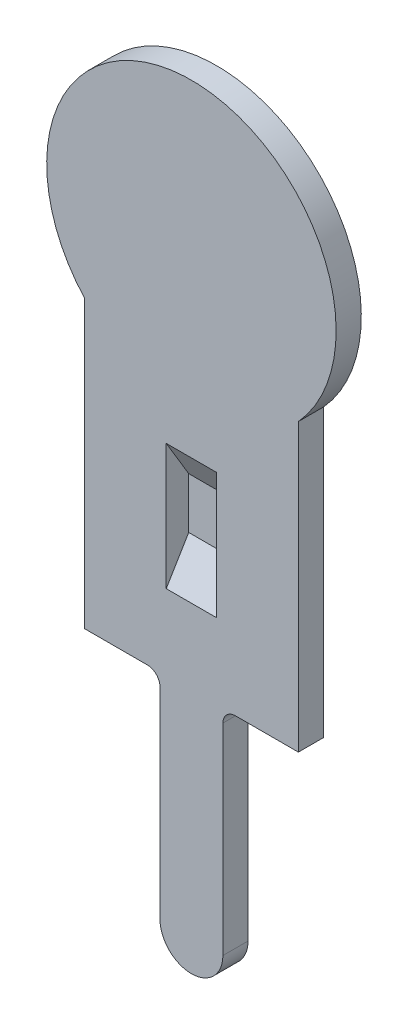
ISO-10303-21;
HEADER;
FILE_DESCRIPTION(('STEP AP214'),'2;1');
FILE_NAME('part.step','',(''),(''),'','','');
FILE_SCHEMA(('AUTOMOTIVE_DESIGN { 1 0 10303 214 1 1 1 1 }'));
ENDSEC;
DATA;
#1=APPLICATION_CONTEXT('core data for automotive mechanical design processes');
#2=APPLICATION_PROTOCOL_DEFINITION('international standard','automotive_design',2000,#1);
#3=PRODUCT_CONTEXT('',#1,'mechanical');
#4=PRODUCT('Part','Part','',(#3));
#5=PRODUCT_RELATED_PRODUCT_CATEGORY('part','',(#4));
#6=PRODUCT_DEFINITION_FORMATION('','',#4);
#7=PRODUCT_DEFINITION_CONTEXT('part definition',#1,'design');
#8=PRODUCT_DEFINITION('design','',#6,#7);
#9=PRODUCT_DEFINITION_SHAPE('','',#8);
#10=(LENGTH_UNIT() NAMED_UNIT(*) SI_UNIT(.MILLI.,.METRE.));
#11=(NAMED_UNIT(*) PLANE_ANGLE_UNIT() SI_UNIT($,.RADIAN.));
#12=(NAMED_UNIT(*) SI_UNIT($,.STERADIAN.) SOLID_ANGLE_UNIT());
#13=UNCERTAINTY_MEASURE_WITH_UNIT(LENGTH_MEASURE(1.E-05),#10,'distance_accuracy_value','');
#14=(GEOMETRIC_REPRESENTATION_CONTEXT(3) GLOBAL_UNCERTAINTY_ASSIGNED_CONTEXT((#13)) GLOBAL_UNIT_ASSIGNED_CONTEXT((#10,
#11,#12)) REPRESENTATION_CONTEXT('',''));
#15=CARTESIAN_POINT('',(0.,0.,0.));
#16=DIRECTION('',(0.,0.,1.));
#17=DIRECTION('',(1.,0.,0.));
#18=AXIS2_PLACEMENT_3D('',#15,#16,#17);
#19=CARTESIAN_POINT('',(0.,6.5,-14.7));
#20=DIRECTION('',(0.,0.,-1.));
#21=DIRECTION('',(-1.,0.,0.));
#22=AXIS2_PLACEMENT_3D('',#19,#20,#21);
#23=PLANE('',#22);
#24=CARTESIAN_POINT('',(0.,6.5,-14.7));
#25=DIRECTION('',(0.,0.,-1.));
#26=DIRECTION('',(-1.,0.,0.));
#27=AXIS2_PLACEMENT_3D('',#24,#25,#26);
#28=CIRCLE('',#27,0.6);
#29=CARTESIAN_POINT('',(-0.6,6.5,-14.7));
#30=VERTEX_POINT('',#29);
#31=EDGE_CURVE('E307',#30,#30,#28,.T.);
#32=ORIENTED_EDGE('',*,*,#31,.T.);
#33=EDGE_LOOP('',(#32));
#34=FACE_BOUND('',#33,.T.);
#35=ADVANCED_FACE('F17',(#34),#23,.T.);
#36=CARTESIAN_POINT('',(0.,6.5,-15.1));
#37=DIRECTION('',(0.,0.,-1.));
#38=DIRECTION('',(-1.,0.,0.));
#39=AXIS2_PLACEMENT_3D('',#36,#37,#38);
#40=CYLINDRICAL_SURFACE('',#39,0.6);
#41=CARTESIAN_POINT('',(0.,6.5,-14.85));
#42=DIRECTION('',(0.,0.,-1.));
#43=DIRECTION('',(-1.,0.,0.));
#44=AXIS2_PLACEMENT_3D('',#41,#42,#43);
#45=CIRCLE('',#44,0.6);
#46=CARTESIAN_POINT('',(-0.6,6.5,-14.85));
#47=VERTEX_POINT('',#46);
#48=EDGE_CURVE('E305',#47,#47,#45,.F.);
#49=ORIENTED_EDGE('',*,*,#48,.F.);
#50=EDGE_LOOP('',(#49));
#51=FACE_BOUND('',#50,.T.);
#52=ORIENTED_EDGE('',*,*,#31,.F.);
#53=EDGE_LOOP('',(#52));
#54=FACE_BOUND('',#53,.T.);
#55=ADVANCED_FACE('F368',(#51,#54),#40,.F.);
#56=CARTESIAN_POINT('',(0.,6.5,-14.85));
#57=DIRECTION('',(0.,0.,-1.));
#58=DIRECTION('',(-1.,0.,0.));
#59=AXIS2_PLACEMENT_3D('',#56,#57,#58);
#60=TOROIDAL_SURFACE('',#59,0.85,0.25);
#61=ORIENTED_EDGE('',*,*,#48,.T.);
#62=EDGE_LOOP('',(#61));
#63=FACE_BOUND('',#62,.T.);
#64=CARTESIAN_POINT('',(0.,6.5,-15.1));
#65=DIRECTION('',(0.,0.,-1.));
#66=DIRECTION('',(-1.,0.,0.));
#67=AXIS2_PLACEMENT_3D('',#64,#65,#66);
#68=CIRCLE('',#67,0.85);
#69=CARTESIAN_POINT('',(0.85,6.5,-15.1));
#70=VERTEX_POINT('',#69);
#71=CARTESIAN_POINT('',(-0.85,6.5,-15.1));
#72=VERTEX_POINT('',#71);
#73=EDGE_CURVE('E261',#70,#72,#68,.F.);
#74=ORIENTED_EDGE('',*,*,#73,.F.);
#75=CARTESIAN_POINT('',(0.,6.5,-15.1));
#76=DIRECTION('',(0.,0.,-1.));
#77=DIRECTION('',(1.,0.,0.));
#78=AXIS2_PLACEMENT_3D('',#75,#76,#77);
#79=CIRCLE('',#78,0.85);
#80=EDGE_CURVE('E304',#72,#70,#79,.F.);
#81=ORIENTED_EDGE('',*,*,#80,.F.);
#82=EDGE_LOOP('',(#74,#81));
#83=FACE_BOUND('',#82,.T.);
#84=ADVANCED_FACE('F239',(#63,#83),#60,.T.);
#85=CARTESIAN_POINT('',(0.,6.5,-15.1));
#86=DIRECTION('',(0.,0.,-1.));
#87=DIRECTION('',(-1.,0.,0.));
#88=AXIS2_PLACEMENT_3D('',#85,#86,#87);
#89=PLANE('',#88);
#90=ORIENTED_EDGE('',*,*,#80,.T.);
#91=ORIENTED_EDGE('',*,*,#73,.T.);
#92=EDGE_LOOP('',(#90,#91));
#93=FACE_BOUND('',#92,.T.);
#94=CARTESIAN_POINT('',(0.,6.5,-15.1));
#95=DIRECTION('',(0.,0.,1.));
#96=DIRECTION('',(1.,0.,0.));
#97=AXIS2_PLACEMENT_3D('',#94,#95,#96);
#98=CIRCLE('',#97,1.1);
#99=CARTESIAN_POINT('',(1.1,6.5,-15.1));
#100=VERTEX_POINT('',#99);
#101=CARTESIAN_POINT('',(-1.1,6.5,-15.1));
#102=VERTEX_POINT('',#101);
#103=EDGE_CURVE('E210',#100,#102,#98,.T.);
#104=ORIENTED_EDGE('',*,*,#103,.F.);
#105=CARTESIAN_POINT('',(0.,6.5,-15.1));
#106=DIRECTION('',(0.,0.,1.));
#107=DIRECTION('',(-1.,0.,0.));
#108=AXIS2_PLACEMENT_3D('',#105,#106,#107);
#109=CIRCLE('',#108,1.1);
#110=EDGE_CURVE('E297',#102,#100,#109,.T.);
#111=ORIENTED_EDGE('',*,*,#110,.F.);
#112=EDGE_LOOP('',(#104,#111));
#113=FACE_BOUND('',#112,.T.);
#114=ADVANCED_FACE('F230',(#93,#113),#89,.T.);
#115=CARTESIAN_POINT('',(0.4,2.961508017526,-14.5));
#116=DIRECTION('',(1.,0.,0.));
#117=DIRECTION('',(0.,0.,-1.));
#118=AXIS2_PLACEMENT_3D('',#115,#116,#117);
#119=CYLINDRICAL_SURFACE('',#118,0.5);
#120=DIRECTION('',(1.,0.,0.));
#121=VECTOR('',#120,1.);
#122=CARTESIAN_POINT('',(0.4,3.21875589524269,-14.9287464628545));
#123=LINE('',#122,#121);
#124=CARTESIAN_POINT('',(-0.4,3.21875589523739,-14.9287464628546));
#125=VERTEX_POINT('',#124);
#126=CARTESIAN_POINT('',(0.4,3.21875589524125,-14.9287464628553));
#127=VERTEX_POINT('',#126);
#128=EDGE_CURVE('E183',#125,#127,#123,.T.);
#129=ORIENTED_EDGE('',*,*,#128,.T.);
#130=CARTESIAN_POINT('',(0.4,2.961508017526,-14.5));
#131=DIRECTION('',(1.,0.,0.));
#132=DIRECTION('',(0.,0.,-1.));
#133=AXIS2_PLACEMENT_3D('',#130,#131,#132);
#134=CIRCLE('',#133,0.5);
#135=CARTESIAN_POINT('',(0.4,2.961508017526,-15.));
#136=VERTEX_POINT('',#135);
#137=EDGE_CURVE('E165',#127,#136,#134,.F.);
#138=ORIENTED_EDGE('',*,*,#137,.T.);
#139=DIRECTION('',(1.,0.,0.));
#140=VECTOR('',#139,1.);
#141=CARTESIAN_POINT('',(0.4,2.961508017526,-15.));
#142=LINE('',#141,#140);
#143=CARTESIAN_POINT('',(-0.4,2.961508017526,-15.));
#144=VERTEX_POINT('',#143);
#145=EDGE_CURVE('E197',#136,#144,#142,.F.);
#146=ORIENTED_EDGE('',*,*,#145,.T.);
#147=CARTESIAN_POINT('',(-0.4,2.961508017526,-14.5));
#148=DIRECTION('',(1.,0.,0.));
#149=DIRECTION('',(0.,0.,-1.));
#150=AXIS2_PLACEMENT_3D('',#147,#148,#149);
#151=CIRCLE('',#150,0.5);
#152=EDGE_CURVE('E190',#125,#144,#151,.F.);
#153=ORIENTED_EDGE('',*,*,#152,.F.);
#154=EDGE_LOOP('',(#129,#138,#146,#153));
#155=FACE_BOUND('',#154,.T.);
#156=ADVANCED_FACE('F189',(#155),#119,.T.);
#157=CARTESIAN_POINT('',(0.4,2.961508017526,-15.));
#158=DIRECTION('',(0.,0.,1.));
#159=DIRECTION('',(1.,0.,0.));
#160=AXIS2_PLACEMENT_3D('',#157,#158,#159);
#161=PLANE('',#160);
#162=DIRECTION('',(0.,1.,0.));
#163=VECTOR('',#162,1.);
#164=CARTESIAN_POINT('',(-0.4,2.961508017526,-15.));
#165=LINE('',#164,#163);
#166=CARTESIAN_POINT('',(-0.4,2.238491982474,-15.));
#167=VERTEX_POINT('',#166);
#168=EDGE_CURVE('E354',#144,#167,#165,.F.);
#169=ORIENTED_EDGE('',*,*,#168,.F.);
#170=ORIENTED_EDGE('',*,*,#145,.F.);
#171=DIRECTION('',(0.,1.,0.));
#172=VECTOR('',#171,1.);
#173=CARTESIAN_POINT('',(0.4,2.961508017526,-15.));
#174=LINE('',#173,#172);
#175=CARTESIAN_POINT('',(0.4,2.238491982474,-15.));
#176=VERTEX_POINT('',#175);
#177=EDGE_CURVE('E174',#136,#176,#174,.F.);
#178=ORIENTED_EDGE('',*,*,#177,.T.);
#179=DIRECTION('',(1.,0.,0.));
#180=VECTOR('',#179,1.);
#181=CARTESIAN_POINT('',(0.4,2.238491982474,-15.));
#182=LINE('',#181,#180);
#183=EDGE_CURVE('E296',#167,#176,#182,.T.);
#184=ORIENTED_EDGE('',*,*,#183,.F.);
#185=EDGE_LOOP('',(#169,#170,#178,#184));
#186=FACE_BOUND('',#185,.T.);
#187=ADVANCED_FACE('F479',(#186),#161,.F.);
#188=CARTESIAN_POINT('',(0.4,2.238491982474,-14.5));
#189=DIRECTION('',(1.,0.,0.));
#190=DIRECTION('',(0.,0.,-1.));
#191=AXIS2_PLACEMENT_3D('',#188,#189,#190);
#192=CYLINDRICAL_SURFACE('',#191,0.5);
#193=ORIENTED_EDGE('',*,*,#183,.T.);
#194=CARTESIAN_POINT('',(0.4,2.238491982474,-14.5));
#195=DIRECTION('',(1.,0.,0.));
#196=DIRECTION('',(0.,0.,-1.));
#197=AXIS2_PLACEMENT_3D('',#194,#195,#196);
#198=CIRCLE('',#197,0.5);
#199=CARTESIAN_POINT('',(0.4,1.98124410476395,-14.9287464628524));
#200=VERTEX_POINT('',#199);
#201=EDGE_CURVE('E356',#176,#200,#198,.F.);
#202=ORIENTED_EDGE('',*,*,#201,.T.);
#203=DIRECTION('',(1.,0.,0.));
#204=VECTOR('',#203,1.);
#205=CARTESIAN_POINT('',(0.4,1.98124410476,-14.92874646285));
#206=LINE('',#205,#204);
#207=CARTESIAN_POINT('',(-0.4,1.98124410476395,-14.9287464628524));
#208=VERTEX_POINT('',#207);
#209=EDGE_CURVE('E178',#200,#208,#206,.F.);
#210=ORIENTED_EDGE('',*,*,#209,.T.);
#211=CARTESIAN_POINT('',(-0.4,2.238491982474,-14.5));
#212=DIRECTION('',(1.,0.,0.));
#213=DIRECTION('',(0.,0.,-1.));
#214=AXIS2_PLACEMENT_3D('',#211,#212,#213);
#215=CIRCLE('',#214,0.5);
#216=EDGE_CURVE('E351',#167,#208,#215,.F.);
#217=ORIENTED_EDGE('',*,*,#216,.F.);
#218=EDGE_LOOP('',(#193,#202,#210,#217));
#219=FACE_BOUND('',#218,.T.);
#220=ADVANCED_FACE('F290',(#219),#192,.T.);
#221=CARTESIAN_POINT('',(0.,6.5,-14.85));
#222=DIRECTION('',(0.,0.,-1.));
#223=DIRECTION('',(-1.,0.,0.));
#224=AXIS2_PLACEMENT_3D('',#221,#222,#223);
#225=TOROIDAL_SURFACE('',#224,1.1,0.25);
#226=ORIENTED_EDGE('',*,*,#110,.T.);
#227=ORIENTED_EDGE('',*,*,#103,.T.);
#228=EDGE_LOOP('',(#226,#227));
#229=FACE_BOUND('',#228,.T.);
#230=CARTESIAN_POINT('',(0.,6.5,-14.85));
#231=DIRECTION('',(0.,0.,-1.));
#232=DIRECTION('',(-1.,0.,0.));
#233=AXIS2_PLACEMENT_3D('',#230,#231,#232);
#234=CIRCLE('',#233,1.35);
#235=CARTESIAN_POINT('',(-1.35,6.5,-14.85));
#236=VERTEX_POINT('',#235);
#237=EDGE_CURVE('E213',#236,#236,#234,.F.);
#238=ORIENTED_EDGE('',*,*,#237,.F.);
#239=EDGE_LOOP('',(#238));
#240=FACE_BOUND('',#239,.T.);
#241=ADVANCED_FACE('F278',(#229,#240),#225,.T.);
#242=CARTESIAN_POINT('',(0.4,1.98124410476,-14.92874646285));
#243=DIRECTION('',(0.,0.514495755427674,0.857492925712456));
#244=DIRECTION('',(0.,-0.857492925712456,0.514495755427674));
#245=AXIS2_PLACEMENT_3D('',#242,#243,#244);
#246=PLANE('',#245);
#247=DIRECTION('',(0.,-0.857492925718497,0.514495755417606));
#248=VECTOR('',#247,1.);
#249=CARTESIAN_POINT('',(-0.4,1.98124410476,-14.92874646285));
#250=LINE('',#249,#248);
#251=CARTESIAN_POINT('',(-0.4,1.60000000000067,-14.7));
#252=VERTEX_POINT('',#251);
#253=EDGE_CURVE('E191',#208,#252,#250,.T.);
#254=ORIENTED_EDGE('',*,*,#253,.F.);
#255=ORIENTED_EDGE('',*,*,#209,.F.);
#256=DIRECTION('',(0.,-0.857492925718497,0.514495755417606));
#257=VECTOR('',#256,1.);
#258=CARTESIAN_POINT('',(0.4,1.98124410476,-14.92874646285));
#259=LINE('',#258,#257);
#260=CARTESIAN_POINT('',(0.4,1.60000000000045,-14.7));
#261=VERTEX_POINT('',#260);
#262=EDGE_CURVE('E186',#200,#261,#259,.T.);
#263=ORIENTED_EDGE('',*,*,#262,.T.);
#264=DIRECTION('',(-1.,0.,0.));
#265=VECTOR('',#264,1.);
#266=CARTESIAN_POINT('',(0.,1.6,-14.7));
#267=LINE('',#266,#265);
#268=EDGE_CURVE('E211',#252,#261,#267,.F.);
#269=ORIENTED_EDGE('',*,*,#268,.F.);
#270=EDGE_LOOP('',(#254,#255,#263,#269));
#271=FACE_BOUND('',#270,.T.);
#272=ADVANCED_FACE('F289',(#271),#246,.F.);
#273=CARTESIAN_POINT('',(0.4,2.961508017526,-14.5));
#274=DIRECTION('',(-1.,0.,0.));
#275=DIRECTION('',(0.,0.,1.));
#276=AXIS2_PLACEMENT_3D('',#273,#274,#275);
#277=PLANE('',#276);
#278=ORIENTED_EDGE('',*,*,#262,.F.);
#279=ORIENTED_EDGE('',*,*,#201,.F.);
#280=ORIENTED_EDGE('',*,*,#177,.F.);
#281=ORIENTED_EDGE('',*,*,#137,.F.);
#282=DIRECTION('',(0.,-0.857492925712456,-0.514495755427674));
#283=VECTOR('',#282,1.);
#284=CARTESIAN_POINT('',(0.4,3.6,-14.7));
#285=LINE('',#284,#283);
#286=CARTESIAN_POINT('',(0.4,3.6,-14.7));
#287=VERTEX_POINT('',#286);
#288=EDGE_CURVE('E170',#127,#287,#285,.F.);
#289=ORIENTED_EDGE('',*,*,#288,.T.);
#290=DIRECTION('',(0.,1.,0.));
#291=VECTOR('',#290,1.);
#292=CARTESIAN_POINT('',(0.4,6.5,-14.7));
#293=LINE('',#292,#291);
#294=EDGE_CURVE('E201',#261,#287,#293,.T.);
#295=ORIENTED_EDGE('',*,*,#294,.F.);
#296=EDGE_LOOP('',(#278,#279,#280,#281,#289,#295));
#297=FACE_BOUND('',#296,.T.);
#298=ADVANCED_FACE('F168',(#297),#277,.F.);
#299=CARTESIAN_POINT('',(0.4,3.6,-14.7));
#300=DIRECTION('',(0.,-0.514495755427674,0.857492925712456));
#301=DIRECTION('',(0.,-0.857492925712456,-0.514495755427674));
#302=AXIS2_PLACEMENT_3D('',#299,#300,#301);
#303=PLANE('',#302);
#304=DIRECTION('',(0.,-0.857492925718496,-0.514495755417606));
#305=VECTOR('',#304,1.);
#306=CARTESIAN_POINT('',(-0.4,3.6,-14.7));
#307=LINE('',#306,#305);
#308=CARTESIAN_POINT('',(-0.4,3.6,-14.7));
#309=VERTEX_POINT('',#308);
#310=EDGE_CURVE('E193',#309,#125,#307,.T.);
#311=ORIENTED_EDGE('',*,*,#310,.F.);
#312=DIRECTION('',(-1.,0.,0.));
#313=VECTOR('',#312,1.);
#314=CARTESIAN_POINT('',(0.,3.6,-14.7));
#315=LINE('',#314,#313);
#316=EDGE_CURVE('E185',#287,#309,#315,.T.);
#317=ORIENTED_EDGE('',*,*,#316,.F.);
#318=ORIENTED_EDGE('',*,*,#288,.F.);
#319=ORIENTED_EDGE('',*,*,#128,.F.);
#320=EDGE_LOOP('',(#311,#317,#318,#319));
#321=FACE_BOUND('',#320,.T.);
#322=ADVANCED_FACE('F182',(#321),#303,.F.);
#323=CARTESIAN_POINT('',(-0.4,2.961508017526,-14.5));
#324=DIRECTION('',(-1.,0.,0.));
#325=DIRECTION('',(0.,0.,1.));
#326=AXIS2_PLACEMENT_3D('',#323,#324,#325);
#327=PLANE('',#326);
#328=ORIENTED_EDGE('',*,*,#168,.T.);
#329=ORIENTED_EDGE('',*,*,#216,.T.);
#330=ORIENTED_EDGE('',*,*,#253,.T.);
#331=DIRECTION('',(0.,1.,0.));
#332=VECTOR('',#331,1.);
#333=CARTESIAN_POINT('',(-0.4,6.5,-14.7));
#334=LINE('',#333,#332);
#335=EDGE_CURVE('E200',#309,#252,#334,.F.);
#336=ORIENTED_EDGE('',*,*,#335,.F.);
#337=ORIENTED_EDGE('',*,*,#310,.T.);
#338=ORIENTED_EDGE('',*,*,#152,.T.);
#339=EDGE_LOOP('',(#328,#329,#330,#336,#337,#338));
#340=FACE_BOUND('',#339,.T.);
#341=ADVANCED_FACE('F449',(#340),#327,.T.);
#342=CARTESIAN_POINT('',(0.,6.5,-15.1));
#343=DIRECTION('',(0.,0.,-1.));
#344=DIRECTION('',(-1.,0.,0.));
#345=AXIS2_PLACEMENT_3D('',#342,#343,#344);
#346=CYLINDRICAL_SURFACE('',#345,1.35);
#347=CARTESIAN_POINT('',(0.,6.5,-14.7));
#348=DIRECTION('',(0.,0.,-1.));
#349=DIRECTION('',(-1.,0.,0.));
#350=AXIS2_PLACEMENT_3D('',#347,#348,#349);
#351=CIRCLE('',#350,1.35);
#352=CARTESIAN_POINT('',(-1.35,6.5,-14.7));
#353=VERTEX_POINT('',#352);
#354=EDGE_CURVE('E206',#353,#353,#351,.F.);
#355=ORIENTED_EDGE('',*,*,#354,.F.);
#356=EDGE_LOOP('',(#355));
#357=FACE_BOUND('',#356,.T.);
#358=ORIENTED_EDGE('',*,*,#237,.T.);
#359=EDGE_LOOP('',(#358));
#360=FACE_BOUND('',#359,.T.);
#361=ADVANCED_FACE('F445',(#357,#360),#346,.T.);
#362=CARTESIAN_POINT('',(0.,6.5,-14.7));
#363=DIRECTION('',(0.,0.,-1.));
#364=DIRECTION('',(-1.,0.,0.));
#365=AXIS2_PLACEMENT_3D('',#362,#363,#364);
#366=PLANE('',#365);
#367=ORIENTED_EDGE('',*,*,#354,.T.);
#368=EDGE_LOOP('',(#367));
#369=FACE_BOUND('',#368,.T.);
#370=ORIENTED_EDGE('',*,*,#316,.T.);
#371=ORIENTED_EDGE('',*,*,#335,.T.);
#372=ORIENTED_EDGE('',*,*,#268,.T.);
#373=ORIENTED_EDGE('',*,*,#294,.T.);
#374=EDGE_LOOP('',(#370,#371,#372,#373));
#375=FACE_BOUND('',#374,.T.);
#376=DIRECTION('',(1.,0.,0.));
#377=VECTOR('',#376,1.);
#378=CARTESIAN_POINT('',(1.7,0.4,-14.7));
#379=LINE('',#378,#377);
#380=CARTESIAN_POINT('',(-0.7,0.4,-14.7));
#381=VERTEX_POINT('',#380);
#382=CARTESIAN_POINT('',(-1.7,0.4,-14.7));
#383=VERTEX_POINT('',#382);
#384=EDGE_CURVE('E768',#381,#383,#379,.F.);
#385=ORIENTED_EDGE('',*,*,#384,.T.);
#386=DIRECTION('',(0.,1.,0.));
#387=VECTOR('',#386,1.);
#388=CARTESIAN_POINT('',(-1.7,4.950806661517,-14.7));
#389=LINE('',#388,#387);
#390=CARTESIAN_POINT('',(-1.69999999999999,4.95080666151702,-14.7));
#391=VERTEX_POINT('',#390);
#392=EDGE_CURVE('E773',#383,#391,#389,.T.);
#393=ORIENTED_EDGE('',*,*,#392,.T.);
#394=CARTESIAN_POINT('',(0.,6.5,-14.7));
#395=DIRECTION('',(0.,0.,-1.));
#396=DIRECTION('',(-1.,0.,0.));
#397=AXIS2_PLACEMENT_3D('',#394,#395,#396);
#398=CIRCLE('',#397,2.3);
#399=CARTESIAN_POINT('',(1.7,4.95080666151702,-14.7));
#400=VERTEX_POINT('',#399);
#401=EDGE_CURVE('E346',#400,#391,#398,.F.);
#402=ORIENTED_EDGE('',*,*,#401,.F.);
#403=DIRECTION('',(0.,-1.,0.));
#404=VECTOR('',#403,1.);
#405=CARTESIAN_POINT('',(1.7,4.950806661517,-14.7));
#406=LINE('',#405,#404);
#407=CARTESIAN_POINT('',(1.7,0.4,-14.7));
#408=VERTEX_POINT('',#407);
#409=EDGE_CURVE('E755',#400,#408,#406,.T.);
#410=ORIENTED_EDGE('',*,*,#409,.T.);
#411=DIRECTION('',(1.,0.,0.));
#412=VECTOR('',#411,1.);
#413=CARTESIAN_POINT('',(1.7,0.4,-14.7));
#414=LINE('',#413,#412);
#415=CARTESIAN_POINT('',(0.7,0.4,-14.7));
#416=VERTEX_POINT('',#415);
#417=EDGE_CURVE('E760',#408,#416,#414,.F.);
#418=ORIENTED_EDGE('',*,*,#417,.T.);
#419=CARTESIAN_POINT('',(0.7,0.2,-14.7));
#420=DIRECTION('',(0.,0.,1.));
#421=DIRECTION('',(1.,0.,0.));
#422=AXIS2_PLACEMENT_3D('',#419,#420,#421);
#423=CIRCLE('',#422,0.2);
#424=CARTESIAN_POINT('',(0.5,0.2,-14.7));
#425=VERTEX_POINT('',#424);
#426=EDGE_CURVE('E341',#416,#425,#423,.T.);
#427=ORIENTED_EDGE('',*,*,#426,.T.);
#428=DIRECTION('',(0.,1.,0.));
#429=VECTOR('',#428,1.);
#430=CARTESIAN_POINT('',(0.5,0.2,-14.7));
#431=LINE('',#430,#429);
#432=CARTESIAN_POINT('',(0.5,-3.,-14.7));
#433=VERTEX_POINT('',#432);
#434=EDGE_CURVE('E344',#433,#425,#431,.T.);
#435=ORIENTED_EDGE('',*,*,#434,.F.);
#436=CARTESIAN_POINT('',(0.,-3.,-14.7));
#437=DIRECTION('',(0.,0.,1.));
#438=DIRECTION('',(1.,0.,0.));
#439=AXIS2_PLACEMENT_3D('',#436,#437,#438);
#440=CIRCLE('',#439,0.5);
#441=CARTESIAN_POINT('',(-0.5,-3.,-14.7));
#442=VERTEX_POINT('',#441);
#443=EDGE_CURVE('E337',#442,#433,#440,.T.);
#444=ORIENTED_EDGE('',*,*,#443,.F.);
#445=DIRECTION('',(0.,-1.,0.));
#446=VECTOR('',#445,1.);
#447=CARTESIAN_POINT('',(-0.5,0.2,-14.7));
#448=LINE('',#447,#446);
#449=CARTESIAN_POINT('',(-0.5,0.2,-14.7));
#450=VERTEX_POINT('',#449);
#451=EDGE_CURVE('E763',#450,#442,#448,.T.);
#452=ORIENTED_EDGE('',*,*,#451,.F.);
#453=CARTESIAN_POINT('',(-0.7,0.2,-14.7));
#454=DIRECTION('',(0.,0.,1.));
#455=DIRECTION('',(1.,0.,0.));
#456=AXIS2_PLACEMENT_3D('',#453,#454,#455);
#457=CIRCLE('',#456,0.2);
#458=EDGE_CURVE('E333',#450,#381,#457,.T.);
#459=ORIENTED_EDGE('',*,*,#458,.T.);
#460=EDGE_LOOP('',(#385,#393,#402,#410,#418,#427,#435,#444,#452,#459));
#461=FACE_BOUND('',#460,.T.);
#462=ADVANCED_FACE('F441',(#369,#375,#461),#366,.T.);
#463=CARTESIAN_POINT('',(0.4,3.005,-14.657));
#464=DIRECTION('',(0.,0.,-1.));
#465=DIRECTION('',(-1.,0.,0.));
#466=AXIS2_PLACEMENT_3D('',#463,#464,#465);
#467=PLANE('',#466);
#468=DIRECTION('',(0.,1.,0.));
#469=VECTOR('',#468,1.);
#470=CARTESIAN_POINT('',(-0.4,3.6,-14.657));
#471=LINE('',#470,#469);
#472=CARTESIAN_POINT('',(-0.4,2.195,-14.657));
#473=VERTEX_POINT('',#472);
#474=CARTESIAN_POINT('',(-0.4,3.00500000000002,-14.657));
#475=VERTEX_POINT('',#474);
#476=EDGE_CURVE('E801',#473,#475,#471,.T.);
#477=ORIENTED_EDGE('',*,*,#476,.F.);
#478=DIRECTION('',(1.,0.,0.));
#479=VECTOR('',#478,1.);
#480=CARTESIAN_POINT('',(0.4,2.195,-14.657));
#481=LINE('',#480,#479);
#482=CARTESIAN_POINT('',(0.4,2.195,-14.657));
#483=VERTEX_POINT('',#482);
#484=EDGE_CURVE('E808',#473,#483,#481,.T.);
#485=ORIENTED_EDGE('',*,*,#484,.T.);
#486=DIRECTION('',(0.,-1.,0.));
#487=VECTOR('',#486,1.);
#488=CARTESIAN_POINT('',(0.4,3.6,-14.657));
#489=LINE('',#488,#487);
#490=CARTESIAN_POINT('',(0.4,3.00500000000003,-14.6570000000001));
#491=VERTEX_POINT('',#490);
#492=EDGE_CURVE('E814',#491,#483,#489,.T.);
#493=ORIENTED_EDGE('',*,*,#492,.F.);
#494=DIRECTION('',(1.,0.,0.));
#495=VECTOR('',#494,1.);
#496=CARTESIAN_POINT('',(0.4,3.00500000000006,-14.6570000000001));
#497=LINE('',#496,#495);
#498=EDGE_CURVE('E798',#491,#475,#497,.F.);
#499=ORIENTED_EDGE('',*,*,#498,.T.);
#500=EDGE_LOOP('',(#477,#485,#493,#499));
#501=FACE_BOUND('',#500,.T.);
#502=ADVANCED_FACE('F437',(#501),#467,.F.);
#503=CARTESIAN_POINT('',(1.7,4.950806661517,-14.7));
#504=DIRECTION('',(-1.,0.,0.));
#505=DIRECTION('',(0.,-1.,0.));
#506=AXIS2_PLACEMENT_3D('',#503,#504,#505);
#507=PLANE('',#506);
#508=DIRECTION('',(0.,0.,1.));
#509=VECTOR('',#508,1.);
#510=CARTESIAN_POINT('',(1.7,0.4,-14.7));
#511=LINE('',#510,#509);
#512=CARTESIAN_POINT('',(1.7,0.4,-14.3));
#513=VERTEX_POINT('',#512);
#514=EDGE_CURVE('E757',#513,#408,#511,.F.);
#515=ORIENTED_EDGE('',*,*,#514,.T.);
#516=ORIENTED_EDGE('',*,*,#409,.F.);
#517=DIRECTION('',(0.,0.,1.));
#518=VECTOR('',#517,1.);
#519=CARTESIAN_POINT('',(1.7,4.950806661517,-14.7));
#520=LINE('',#519,#518);
#521=CARTESIAN_POINT('',(1.7,4.95080666151702,-14.3));
#522=VERTEX_POINT('',#521);
#523=EDGE_CURVE('E348',#522,#400,#520,.F.);
#524=ORIENTED_EDGE('',*,*,#523,.F.);
#525=DIRECTION('',(0.,1.,0.));
#526=VECTOR('',#525,1.);
#527=CARTESIAN_POINT('',(1.7,6.5,-14.3));
#528=LINE('',#527,#526);
#529=EDGE_CURVE('E332',#522,#513,#528,.F.);
#530=ORIENTED_EDGE('',*,*,#529,.T.);
#531=EDGE_LOOP('',(#515,#516,#524,#530));
#532=FACE_BOUND('',#531,.T.);
#533=ADVANCED_FACE('F433',(#532),#507,.F.);
#534=CARTESIAN_POINT('',(1.7,0.4,-14.7));
#535=DIRECTION('',(0.,1.,0.));
#536=DIRECTION('',(0.,0.,1.));
#537=AXIS2_PLACEMENT_3D('',#534,#535,#536);
#538=PLANE('',#537);
#539=ORIENTED_EDGE('',*,*,#417,.F.);
#540=ORIENTED_EDGE('',*,*,#514,.F.);
#541=DIRECTION('',(-1.,0.,0.));
#542=VECTOR('',#541,1.);
#543=CARTESIAN_POINT('',(0.,0.4,-14.3));
#544=LINE('',#543,#542);
#545=CARTESIAN_POINT('',(0.7,0.4,-14.3));
#546=VERTEX_POINT('',#545);
#547=EDGE_CURVE('E329',#513,#546,#544,.T.);
#548=ORIENTED_EDGE('',*,*,#547,.T.);
#549=DIRECTION('',(0.,0.,1.));
#550=VECTOR('',#549,1.);
#551=CARTESIAN_POINT('',(0.7,0.4,-14.3));
#552=LINE('',#551,#550);
#553=EDGE_CURVE('E345',#546,#416,#552,.F.);
#554=ORIENTED_EDGE('',*,*,#553,.T.);
#555=EDGE_LOOP('',(#539,#540,#548,#554));
#556=FACE_BOUND('',#555,.T.);
#557=ADVANCED_FACE('F429',(#556),#538,.F.);
#558=CARTESIAN_POINT('',(0.7,0.2,-14.3));
#559=DIRECTION('',(0.,0.,1.));
#560=DIRECTION('',(1.,0.,0.));
#561=AXIS2_PLACEMENT_3D('',#558,#559,#560);
#562=CYLINDRICAL_SURFACE('',#561,0.2);
#563=ORIENTED_EDGE('',*,*,#553,.F.);
#564=CARTESIAN_POINT('',(0.7,0.2,-14.3));
#565=DIRECTION('',(0.,0.,1.));
#566=DIRECTION('',(1.,0.,0.));
#567=AXIS2_PLACEMENT_3D('',#564,#565,#566);
#568=CIRCLE('',#567,0.2);
#569=CARTESIAN_POINT('',(0.5,0.2,-14.3));
#570=VERTEX_POINT('',#569);
#571=EDGE_CURVE('E326',#546,#570,#568,.T.);
#572=ORIENTED_EDGE('',*,*,#571,.T.);
#573=DIRECTION('',(0.,0.,1.));
#574=VECTOR('',#573,1.);
#575=CARTESIAN_POINT('',(0.5,0.2,-14.3));
#576=LINE('',#575,#574);
#577=EDGE_CURVE('E340',#425,#570,#576,.T.);
#578=ORIENTED_EDGE('',*,*,#577,.F.);
#579=ORIENTED_EDGE('',*,*,#426,.F.);
#580=EDGE_LOOP('',(#563,#572,#578,#579));
#581=FACE_BOUND('',#580,.T.);
#582=ADVANCED_FACE('F425',(#581),#562,.F.);
#583=CARTESIAN_POINT('',(0.5,0.2,-14.3));
#584=DIRECTION('',(1.,0.,0.));
#585=DIRECTION('',(0.,1.,0.));
#586=AXIS2_PLACEMENT_3D('',#583,#584,#585);
#587=PLANE('',#586);
#588=DIRECTION('',(0.,1.,0.));
#589=VECTOR('',#588,1.);
#590=CARTESIAN_POINT('',(0.5,6.5,-14.3));
#591=LINE('',#590,#589);
#592=CARTESIAN_POINT('',(0.5,-3.,-14.3));
#593=VERTEX_POINT('',#592);
#594=EDGE_CURVE('E325',#570,#593,#591,.F.);
#595=ORIENTED_EDGE('',*,*,#594,.T.);
#596=DIRECTION('',(0.,0.,1.));
#597=VECTOR('',#596,1.);
#598=CARTESIAN_POINT('',(0.5,-3.,-14.3));
#599=LINE('',#598,#597);
#600=EDGE_CURVE('E339',#433,#593,#599,.T.);
#601=ORIENTED_EDGE('',*,*,#600,.F.);
#602=ORIENTED_EDGE('',*,*,#434,.T.);
#603=ORIENTED_EDGE('',*,*,#577,.T.);
#604=EDGE_LOOP('',(#595,#601,#602,#603));
#605=FACE_BOUND('',#604,.T.);
#606=ADVANCED_FACE('F421',(#605),#587,.T.);
#607=CARTESIAN_POINT('',(0.,-3.,-14.3));
#608=DIRECTION('',(0.,0.,1.));
#609=DIRECTION('',(1.,0.,0.));
#610=AXIS2_PLACEMENT_3D('',#607,#608,#609);
#611=CYLINDRICAL_SURFACE('',#610,0.5);
#612=CARTESIAN_POINT('',(0.,-3.,-14.3));
#613=DIRECTION('',(0.,0.,1.));
#614=DIRECTION('',(1.,0.,0.));
#615=AXIS2_PLACEMENT_3D('',#612,#613,#614);
#616=CIRCLE('',#615,0.5);
#617=CARTESIAN_POINT('',(-0.5,-3.,-14.3));
#618=VERTEX_POINT('',#617);
#619=EDGE_CURVE('E322',#593,#618,#616,.F.);
#620=ORIENTED_EDGE('',*,*,#619,.T.);
#621=DIRECTION('',(0.,0.,1.));
#622=VECTOR('',#621,1.);
#623=CARTESIAN_POINT('',(-0.5,-3.,-14.3));
#624=LINE('',#623,#622);
#625=EDGE_CURVE('E765',#442,#618,#624,.T.);
#626=ORIENTED_EDGE('',*,*,#625,.F.);
#627=ORIENTED_EDGE('',*,*,#443,.T.);
#628=ORIENTED_EDGE('',*,*,#600,.T.);
#629=EDGE_LOOP('',(#620,#626,#627,#628));
#630=FACE_BOUND('',#629,.T.);
#631=ADVANCED_FACE('F417',(#630),#611,.T.);
#632=CARTESIAN_POINT('',(-0.5,0.2,-14.3));
#633=DIRECTION('',(-1.,0.,0.));
#634=DIRECTION('',(0.,-1.,0.));
#635=AXIS2_PLACEMENT_3D('',#632,#633,#634);
#636=PLANE('',#635);
#637=DIRECTION('',(0.,1.,0.));
#638=VECTOR('',#637,1.);
#639=CARTESIAN_POINT('',(-0.5,6.5,-14.3));
#640=LINE('',#639,#638);
#641=CARTESIAN_POINT('',(-0.5,0.2,-14.3));
#642=VERTEX_POINT('',#641);
#643=EDGE_CURVE('E321',#618,#642,#640,.T.);
#644=ORIENTED_EDGE('',*,*,#643,.T.);
#645=DIRECTION('',(0.,0.,1.));
#646=VECTOR('',#645,1.);
#647=CARTESIAN_POINT('',(-0.5,0.2,-14.3));
#648=LINE('',#647,#646);
#649=EDGE_CURVE('E336',#642,#450,#648,.F.);
#650=ORIENTED_EDGE('',*,*,#649,.T.);
#651=ORIENTED_EDGE('',*,*,#451,.T.);
#652=ORIENTED_EDGE('',*,*,#625,.T.);
#653=EDGE_LOOP('',(#644,#650,#651,#652));
#654=FACE_BOUND('',#653,.T.);
#655=ADVANCED_FACE('F413',(#654),#636,.T.);
#656=CARTESIAN_POINT('',(-0.7,0.2,-14.3));
#657=DIRECTION('',(0.,0.,1.));
#658=DIRECTION('',(1.,0.,0.));
#659=AXIS2_PLACEMENT_3D('',#656,#657,#658);
#660=CYLINDRICAL_SURFACE('',#659,0.2);
#661=ORIENTED_EDGE('',*,*,#649,.F.);
#662=CARTESIAN_POINT('',(-0.7,0.2,-14.3));
#663=DIRECTION('',(0.,0.,1.));
#664=DIRECTION('',(1.,0.,0.));
#665=AXIS2_PLACEMENT_3D('',#662,#663,#664);
#666=CIRCLE('',#665,0.2);
#667=CARTESIAN_POINT('',(-0.7,0.4,-14.3));
#668=VERTEX_POINT('',#667);
#669=EDGE_CURVE('E317',#642,#668,#666,.T.);
#670=ORIENTED_EDGE('',*,*,#669,.T.);
#671=DIRECTION('',(0.,0.,1.));
#672=VECTOR('',#671,1.);
#673=CARTESIAN_POINT('',(-0.7,0.4,-14.7));
#674=LINE('',#673,#672);
#675=EDGE_CURVE('E335',#668,#381,#674,.F.);
#676=ORIENTED_EDGE('',*,*,#675,.T.);
#677=ORIENTED_EDGE('',*,*,#458,.F.);
#678=EDGE_LOOP('',(#661,#670,#676,#677));
#679=FACE_BOUND('',#678,.T.);
#680=ADVANCED_FACE('F409',(#679),#660,.F.);
#681=CARTESIAN_POINT('',(1.7,0.4,-14.7));
#682=DIRECTION('',(0.,1.,0.));
#683=DIRECTION('',(0.,0.,1.));
#684=AXIS2_PLACEMENT_3D('',#681,#682,#683);
#685=PLANE('',#684);
#686=ORIENTED_EDGE('',*,*,#675,.F.);
#687=DIRECTION('',(-1.,0.,0.));
#688=VECTOR('',#687,1.);
#689=CARTESIAN_POINT('',(0.,0.4,-14.3));
#690=LINE('',#689,#688);
#691=CARTESIAN_POINT('',(-1.7,0.4,-14.3));
#692=VERTEX_POINT('',#691);
#693=EDGE_CURVE('E320',#668,#692,#690,.T.);
#694=ORIENTED_EDGE('',*,*,#693,.T.);
#695=DIRECTION('',(0.,0.,-1.));
#696=VECTOR('',#695,1.);
#697=CARTESIAN_POINT('',(-1.7,0.4,-14.7));
#698=LINE('',#697,#696);
#699=EDGE_CURVE('E770',#692,#383,#698,.T.);
#700=ORIENTED_EDGE('',*,*,#699,.T.);
#701=ORIENTED_EDGE('',*,*,#384,.F.);
#702=EDGE_LOOP('',(#686,#694,#700,#701));
#703=FACE_BOUND('',#702,.T.);
#704=ADVANCED_FACE('F405',(#703),#685,.F.);
#705=CARTESIAN_POINT('',(-1.7,4.950806661517,-14.7));
#706=DIRECTION('',(1.,0.,0.));
#707=DIRECTION('',(0.,0.,-1.));
#708=AXIS2_PLACEMENT_3D('',#705,#706,#707);
#709=PLANE('',#708);
#710=DIRECTION('',(0.,0.,-1.));
#711=VECTOR('',#710,1.);
#712=CARTESIAN_POINT('',(-1.69999999999998,4.95080666151701,-14.7));
#713=LINE('',#712,#711);
#714=CARTESIAN_POINT('',(-1.69999999999999,4.95080666151702,-14.3));
#715=VERTEX_POINT('',#714);
#716=EDGE_CURVE('E776',#391,#715,#713,.F.);
#717=ORIENTED_EDGE('',*,*,#716,.F.);
#718=ORIENTED_EDGE('',*,*,#392,.F.);
#719=ORIENTED_EDGE('',*,*,#699,.F.);
#720=DIRECTION('',(0.,1.,0.));
#721=VECTOR('',#720,1.);
#722=CARTESIAN_POINT('',(-1.7,6.5,-14.3));
#723=LINE('',#722,#721);
#724=EDGE_CURVE('E833',#692,#715,#723,.T.);
#725=ORIENTED_EDGE('',*,*,#724,.T.);
#726=EDGE_LOOP('',(#717,#718,#719,#725));
#727=FACE_BOUND('',#726,.T.);
#728=ADVANCED_FACE('F401',(#727),#709,.F.);
#729=CARTESIAN_POINT('',(0.,6.5,-14.7));
#730=DIRECTION('',(0.,0.,-1.));
#731=DIRECTION('',(-1.,0.,0.));
#732=AXIS2_PLACEMENT_3D('',#729,#730,#731);
#733=CYLINDRICAL_SURFACE('',#732,2.3);
#734=ORIENTED_EDGE('',*,*,#716,.T.);
#735=CARTESIAN_POINT('',(0.,6.5,-14.3));
#736=DIRECTION('',(0.,0.,-1.));
#737=DIRECTION('',(-1.,0.,0.));
#738=AXIS2_PLACEMENT_3D('',#735,#736,#737);
#739=CIRCLE('',#738,2.3);
#740=EDGE_CURVE('E330',#715,#522,#739,.T.);
#741=ORIENTED_EDGE('',*,*,#740,.T.);
#742=ORIENTED_EDGE('',*,*,#523,.T.);
#743=ORIENTED_EDGE('',*,*,#401,.T.);
#744=EDGE_LOOP('',(#734,#741,#742,#743));
#745=FACE_BOUND('',#744,.T.);
#746=ADVANCED_FACE('F397',(#745),#733,.T.);
#747=CARTESIAN_POINT('',(0.4,3.6,-14.3));
#748=DIRECTION('',(0.,0.514495755427674,-0.857492925712456));
#749=DIRECTION('',(0.,0.857492925712456,0.514495755427674));
#750=AXIS2_PLACEMENT_3D('',#747,#748,#749);
#751=PLANE('',#750);
#752=DIRECTION('',(0.,0.857492925712545,0.514495755427526));
#753=VECTOR('',#752,1.);
#754=CARTESIAN_POINT('',(-0.4,3.005,-14.657));
#755=LINE('',#754,#753);
#756=CARTESIAN_POINT('',(-0.4,3.6,-14.3));
#757=VERTEX_POINT('',#756);
#758=EDGE_CURVE('E803',#475,#757,#755,.T.);
#759=ORIENTED_EDGE('',*,*,#758,.F.);
#760=ORIENTED_EDGE('',*,*,#498,.F.);
#761=DIRECTION('',(0.,-0.857492925712545,-0.514495755427526));
#762=VECTOR('',#761,1.);
#763=CARTESIAN_POINT('',(0.4,3.6,-14.3));
#764=LINE('',#763,#762);
#765=CARTESIAN_POINT('',(0.4,3.6,-14.3));
#766=VERTEX_POINT('',#765);
#767=EDGE_CURVE('E811',#766,#491,#764,.T.);
#768=ORIENTED_EDGE('',*,*,#767,.F.);
#769=DIRECTION('',(-1.,0.,0.));
#770=VECTOR('',#769,1.);
#771=CARTESIAN_POINT('',(0.,3.6,-14.3));
#772=LINE('',#771,#770);
#773=EDGE_CURVE('E838',#766,#757,#772,.T.);
#774=ORIENTED_EDGE('',*,*,#773,.T.);
#775=EDGE_LOOP('',(#759,#760,#768,#774));
#776=FACE_BOUND('',#775,.T.);
#777=ADVANCED_FACE('F393',(#776),#751,.F.);
#778=CARTESIAN_POINT('',(-0.4,3.6,-14.7));
#779=DIRECTION('',(1.,0.,0.));
#780=DIRECTION('',(0.,1.,0.));
#781=AXIS2_PLACEMENT_3D('',#778,#779,#780);
#782=PLANE('',#781);
#783=DIRECTION('',(0.,1.,0.));
#784=VECTOR('',#783,1.);
#785=CARTESIAN_POINT('',(-0.4,6.5,-14.3));
#786=LINE('',#785,#784);
#787=CARTESIAN_POINT('',(-0.4,1.60000000000002,-14.3));
#788=VERTEX_POINT('',#787);
#789=EDGE_CURVE('E841',#757,#788,#786,.F.);
#790=ORIENTED_EDGE('',*,*,#789,.T.);
#791=DIRECTION('',(0.,0.857492925712456,-0.514495755427674));
#792=VECTOR('',#791,1.);
#793=CARTESIAN_POINT('',(-0.4,2.195,-14.657));
#794=LINE('',#793,#792);
#795=EDGE_CURVE('E805',#788,#473,#794,.T.);
#796=ORIENTED_EDGE('',*,*,#795,.T.);
#797=ORIENTED_EDGE('',*,*,#476,.T.);
#798=ORIENTED_EDGE('',*,*,#758,.T.);
#799=EDGE_LOOP('',(#790,#796,#797,#798));
#800=FACE_BOUND('',#799,.T.);
#801=ADVANCED_FACE('F389',(#800),#782,.T.);
#802=CARTESIAN_POINT('',(0.4,2.195,-14.657));
#803=DIRECTION('',(0.,-0.514495755427674,-0.857492925712456));
#804=DIRECTION('',(0.,0.857492925712456,-0.514495755427674));
#805=AXIS2_PLACEMENT_3D('',#802,#803,#804);
#806=PLANE('',#805);
#807=ORIENTED_EDGE('',*,*,#795,.F.);
#808=DIRECTION('',(-1.,0.,0.));
#809=VECTOR('',#808,1.);
#810=CARTESIAN_POINT('',(0.,1.6,-14.3));
#811=LINE('',#810,#809);
#812=CARTESIAN_POINT('',(0.4,1.60000000000003,-14.2999999999999));
#813=VERTEX_POINT('',#812);
#814=EDGE_CURVE('E28',#788,#813,#811,.F.);
#815=ORIENTED_EDGE('',*,*,#814,.T.);
#816=DIRECTION('',(0.,-0.857492925712544,0.514495755427526));
#817=VECTOR('',#816,1.);
#818=CARTESIAN_POINT('',(0.4,2.195,-14.657));
#819=LINE('',#818,#817);
#820=EDGE_CURVE('E36',#483,#813,#819,.T.);
#821=ORIENTED_EDGE('',*,*,#820,.F.);
#822=ORIENTED_EDGE('',*,*,#484,.F.);
#823=EDGE_LOOP('',(#807,#815,#821,#822));
#824=FACE_BOUND('',#823,.T.);
#825=ADVANCED_FACE('F382',(#824),#806,.F.);
#826=CARTESIAN_POINT('',(0.4,3.6,-14.7));
#827=DIRECTION('',(-1.,0.,0.));
#828=DIRECTION('',(0.,-1.,0.));
#829=AXIS2_PLACEMENT_3D('',#826,#827,#828);
#830=PLANE('',#829);
#831=ORIENTED_EDGE('',*,*,#492,.T.);
#832=ORIENTED_EDGE('',*,*,#820,.T.);
#833=DIRECTION('',(0.,1.,0.));
#834=VECTOR('',#833,1.);
#835=CARTESIAN_POINT('',(0.4,6.5,-14.3));
#836=LINE('',#835,#834);
#837=EDGE_CURVE('E11',#813,#766,#836,.T.);
#838=ORIENTED_EDGE('',*,*,#837,.T.);
#839=ORIENTED_EDGE('',*,*,#767,.T.);
#840=EDGE_LOOP('',(#831,#832,#838,#839));
#841=FACE_BOUND('',#840,.T.);
#842=ADVANCED_FACE('F376',(#841),#830,.T.);
#843=CARTESIAN_POINT('',(0.,6.5,-14.3));
#844=DIRECTION('',(0.,0.,-1.));
#845=DIRECTION('',(-1.,0.,0.));
#846=AXIS2_PLACEMENT_3D('',#843,#844,#845);
#847=PLANE('',#846);
#848=ORIENTED_EDGE('',*,*,#814,.F.);
#849=ORIENTED_EDGE('',*,*,#789,.F.);
#850=ORIENTED_EDGE('',*,*,#773,.F.);
#851=ORIENTED_EDGE('',*,*,#837,.F.);
#852=EDGE_LOOP('',(#848,#849,#850,#851));
#853=FACE_BOUND('',#852,.T.);
#854=ORIENTED_EDGE('',*,*,#724,.F.);
#855=ORIENTED_EDGE('',*,*,#693,.F.);
#856=ORIENTED_EDGE('',*,*,#669,.F.);
#857=ORIENTED_EDGE('',*,*,#643,.F.);
#858=ORIENTED_EDGE('',*,*,#619,.F.);
#859=ORIENTED_EDGE('',*,*,#594,.F.);
#860=ORIENTED_EDGE('',*,*,#571,.F.);
#861=ORIENTED_EDGE('',*,*,#547,.F.);
#862=ORIENTED_EDGE('',*,*,#529,.F.);
#863=ORIENTED_EDGE('',*,*,#740,.F.);
#864=EDGE_LOOP('',(#854,#855,#856,#857,#858,#859,#860,#861,#862,#863));
#865=FACE_BOUND('',#864,.T.);
#866=ADVANCED_FACE('F374',(#853,#865),#847,.F.);
#867=CLOSED_SHELL('',(#35,#55,#84,#114,#156,#187,#220,#241,#272,#298,#322,#341,#361,#462,#502,
#533,#557,#582,#606,#631,#655,#680,#704,#728,#746,#777,#801,#825,#842,#866));
#868=MANIFOLD_SOLID_BREP('B1',#867);
#869=ADVANCED_BREP_SHAPE_REPRESENTATION('',(#18,#868),#14);
#870=SHAPE_DEFINITION_REPRESENTATION(#9,#869);
ENDSEC;
END-ISO-10303-21;
